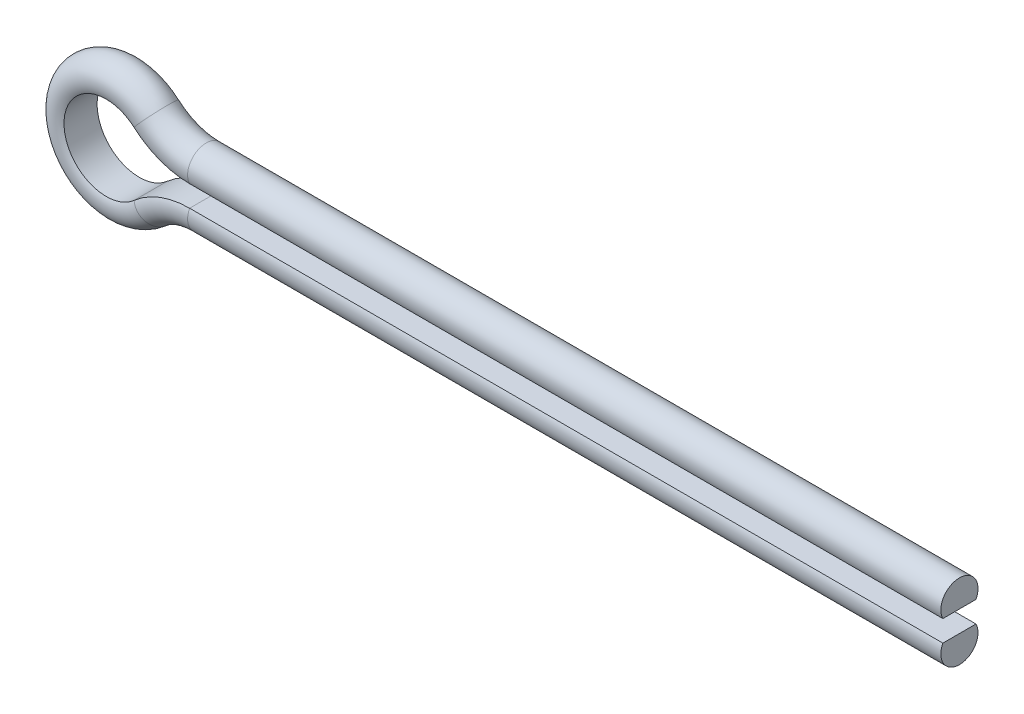
ISO-10303-21;
HEADER;
FILE_DESCRIPTION(('STEP AP214'),'2;1');
FILE_NAME('part.step','',(''),(''),'','','');
FILE_SCHEMA(('AUTOMOTIVE_DESIGN { 1 0 10303 214 1 1 1 1 }'));
ENDSEC;
DATA;
#1=APPLICATION_CONTEXT('core data for automotive mechanical design processes');
#2=APPLICATION_PROTOCOL_DEFINITION('international standard','automotive_design',2000,#1);
#3=PRODUCT_CONTEXT('',#1,'mechanical');
#4=PRODUCT('Part','Part','',(#3));
#5=PRODUCT_RELATED_PRODUCT_CATEGORY('part','',(#4));
#6=PRODUCT_DEFINITION_FORMATION('','',#4);
#7=PRODUCT_DEFINITION_CONTEXT('part definition',#1,'design');
#8=PRODUCT_DEFINITION('design','',#6,#7);
#9=PRODUCT_DEFINITION_SHAPE('','',#8);
#10=(LENGTH_UNIT() NAMED_UNIT(*) SI_UNIT(.MILLI.,.METRE.));
#11=(NAMED_UNIT(*) PLANE_ANGLE_UNIT() SI_UNIT($,.RADIAN.));
#12=(NAMED_UNIT(*) SI_UNIT($,.STERADIAN.) SOLID_ANGLE_UNIT());
#13=UNCERTAINTY_MEASURE_WITH_UNIT(LENGTH_MEASURE(1.E-05),#10,'distance_accuracy_value','');
#14=(GEOMETRIC_REPRESENTATION_CONTEXT(3) GLOBAL_UNCERTAINTY_ASSIGNED_CONTEXT((#13)) GLOBAL_UNIT_ASSIGNED_CONTEXT((#10,
#11,#12)) REPRESENTATION_CONTEXT('',''));
#15=CARTESIAN_POINT('',(0.,0.,0.));
#16=DIRECTION('',(0.,0.,1.));
#17=DIRECTION('',(1.,0.,0.));
#18=AXIS2_PLACEMENT_3D('',#15,#16,#17);
#19=CARTESIAN_POINT('',(956.940936911488,7.39227363049866,0.));
#20=DIRECTION('',(-1.,0.,0.));
#21=DIRECTION('',(0.,-1.,0.));
#22=AXIS2_PLACEMENT_3D('',#19,#20,#21);
#23=PLANE('',#22);
#24=CARTESIAN_POINT('',(956.940936911488,7.39227363049866,0.));
#25=DIRECTION('',(-1.,0.,0.));
#26=DIRECTION('',(0.,-1.,0.));
#27=AXIS2_PLACEMENT_3D('',#24,#25,#26);
#28=CIRCLE('',#27,22.0906627533993);
#29=CARTESIAN_POINT('',(956.940936911488,-2.60772636950265,19.6976491207554));
#30=VERTEX_POINT('',#29);
#31=CARTESIAN_POINT('',(956.940936911488,-2.60772636950265,-19.6976491207554));
#32=VERTEX_POINT('',#31);
#33=EDGE_CURVE('E79',#30,#32,#28,.T.);
#34=ORIENTED_EDGE('',*,*,#33,.F.);
#35=DIRECTION('',(0.,0.,1.));
#36=VECTOR('',#35,1.);
#37=CARTESIAN_POINT('',(956.940936911488,-2.60772636950265,19.6976491207554));
#38=LINE('',#37,#36);
#39=EDGE_CURVE('E81',#32,#30,#38,.T.);
#40=ORIENTED_EDGE('',*,*,#39,.F.);
#41=EDGE_LOOP('',(#34,#40));
#42=FACE_BOUND('',#41,.T.);
#43=ADVANCED_FACE('F33',(#42),#23,.F.);
#44=CARTESIAN_POINT('',(956.940936911488,-37.8597165883777,0.));
#45=DIRECTION('',(1.,0.,0.));
#46=DIRECTION('',(0.,1.,0.));
#47=AXIS2_PLACEMENT_3D('',#44,#45,#46);
#48=PLANE('',#47);
#49=CARTESIAN_POINT('',(956.940936911488,-37.8597165883777,0.));
#50=DIRECTION('',(1.,0.,0.));
#51=DIRECTION('',(0.,1.,0.));
#52=AXIS2_PLACEMENT_3D('',#49,#50,#51);
#53=CIRCLE('',#52,22.0906627533993);
#54=CARTESIAN_POINT('',(956.940936911488,-27.8597165883764,19.6976491207554));
#55=VERTEX_POINT('',#54);
#56=CARTESIAN_POINT('',(956.940936911488,-27.8597165883764,-19.6976491207554));
#57=VERTEX_POINT('',#56);
#58=EDGE_CURVE('E45',#55,#57,#53,.T.);
#59=ORIENTED_EDGE('',*,*,#58,.T.);
#60=DIRECTION('',(0.,0.,1.));
#61=VECTOR('',#60,1.);
#62=CARTESIAN_POINT('',(956.940936911488,-27.8597165883764,19.6976491207554));
#63=LINE('',#62,#61);
#64=EDGE_CURVE('E11',#57,#55,#63,.T.);
#65=ORIENTED_EDGE('',*,*,#64,.T.);
#66=EDGE_LOOP('',(#59,#65));
#67=FACE_BOUND('',#66,.T.);
#68=ADVANCED_FACE('F184',(#67),#48,.T.);
#69=CARTESIAN_POINT('',(956.940936911488,7.39227363049866,0.));
#70=DIRECTION('',(-1.,0.,0.));
#71=DIRECTION('',(0.,-1.,0.));
#72=AXIS2_PLACEMENT_3D('',#69,#70,#71);
#73=CYLINDRICAL_SURFACE('',#72,22.0906627533993);
#74=DIRECTION('',(-1.,0.,0.));
#75=VECTOR('',#74,1.);
#76=CARTESIAN_POINT('',(956.940936911488,-2.60772636950265,-19.6976491207554));
#77=LINE('',#76,#75);
#78=CARTESIAN_POINT('',(61.4743425774758,-2.60772636950276,-19.6976491207554));
#79=VERTEX_POINT('',#78);
#80=EDGE_CURVE('E92',#32,#79,#77,.T.);
#81=ORIENTED_EDGE('',*,*,#80,.T.);
#82=CARTESIAN_POINT('',(61.4743425774758,7.39227363049855,0.));
#83=DIRECTION('',(-1.,0.,0.));
#84=DIRECTION('',(0.,-1.,0.));
#85=AXIS2_PLACEMENT_3D('',#82,#83,#84);
#86=CIRCLE('',#85,22.0906627533993);
#87=CARTESIAN_POINT('',(61.4743425774758,-2.60772636950276,19.6976491207554));
#88=VERTEX_POINT('',#87);
#89=EDGE_CURVE('E97',#88,#79,#86,.T.);
#90=ORIENTED_EDGE('',*,*,#89,.F.);
#91=DIRECTION('',(-1.,0.,0.));
#92=VECTOR('',#91,1.);
#93=CARTESIAN_POINT('',(956.940936911488,-2.60772636950265,19.6976491207554));
#94=LINE('',#93,#92);
#95=EDGE_CURVE('E91',#30,#88,#94,.T.);
#96=ORIENTED_EDGE('',*,*,#95,.F.);
#97=ORIENTED_EDGE('',*,*,#33,.T.);
#98=EDGE_LOOP('',(#81,#90,#96,#97));
#99=FACE_BOUND('',#98,.T.);
#100=ADVANCED_FACE('F95',(#99),#73,.T.);
#101=CARTESIAN_POINT('',(956.940936911488,-2.60772636950265,19.6976491207554));
#102=DIRECTION('',(0.,-1.,0.));
#103=DIRECTION('',(1.,0.,0.));
#104=AXIS2_PLACEMENT_3D('',#101,#102,#103);
#105=PLANE('',#104);
#106=DIRECTION('',(0.,0.,1.));
#107=VECTOR('',#106,1.);
#108=CARTESIAN_POINT('',(61.4743425774758,-2.60772636950276,19.6976491207554));
#109=LINE('',#108,#107);
#110=EDGE_CURVE('E112',#79,#88,#109,.T.);
#111=ORIENTED_EDGE('',*,*,#110,.F.);
#112=ORIENTED_EDGE('',*,*,#80,.F.);
#113=ORIENTED_EDGE('',*,*,#39,.T.);
#114=ORIENTED_EDGE('',*,*,#95,.T.);
#115=EDGE_LOOP('',(#111,#112,#113,#114));
#116=FACE_BOUND('',#115,.T.);
#117=ADVANCED_FACE('F90',(#116),#105,.T.);
#118=CARTESIAN_POINT('',(61.4743425774757,97.2662785210603,0.));
#119=DIRECTION('',(0.,0.,-1.));
#120=DIRECTION('',(-1.,0.,0.));
#121=AXIS2_PLACEMENT_3D('',#118,#119,#120);
#122=TOROIDAL_SURFACE('',#121,89.8740048905617,22.0906627533993);
#123=CARTESIAN_POINT('',(61.4743425774757,97.2662785210603,-19.6976491207554));
#124=DIRECTION('',(0.,0.,-1.));
#125=DIRECTION('',(0.,-1.,0.));
#126=AXIS2_PLACEMENT_3D('',#123,#124,#125);
#127=CIRCLE('',#126,99.874004890563);
#128=CARTESIAN_POINT('',(-4.586102267644,22.3607748531382,-19.6976491207554));
#129=VERTEX_POINT('',#128);
#130=EDGE_CURVE('E105',#79,#129,#127,.T.);
#131=ORIENTED_EDGE('',*,*,#130,.T.);
#132=CARTESIAN_POINT('',(2.02827601001832,29.8607748531391,0.));
#133=DIRECTION('',(-0.749999999999999,0.661437827766149,0.));
#134=DIRECTION('',(-0.661437827766149,-0.749999999999999,0.));
#135=AXIS2_PLACEMENT_3D('',#132,#133,#134);
#136=CIRCLE('',#135,22.0906627533993);
#137=CARTESIAN_POINT('',(-4.586102267644,22.3607748531382,19.6976491207554));
#138=VERTEX_POINT('',#137);
#139=EDGE_CURVE('E102',#138,#129,#136,.T.);
#140=ORIENTED_EDGE('',*,*,#139,.F.);
#141=CARTESIAN_POINT('',(61.4743425774757,97.2662785210603,19.6976491207554));
#142=DIRECTION('',(0.,0.,-1.));
#143=DIRECTION('',(0.,-1.,0.));
#144=AXIS2_PLACEMENT_3D('',#141,#142,#143);
#145=CIRCLE('',#144,99.874004890563);
#146=EDGE_CURVE('E106',#88,#138,#145,.T.);
#147=ORIENTED_EDGE('',*,*,#146,.F.);
#148=ORIENTED_EDGE('',*,*,#89,.T.);
#149=EDGE_LOOP('',(#131,#140,#147,#148));
#150=FACE_BOUND('',#149,.T.);
#151=ADVANCED_FACE('F164',(#150),#122,.T.);
#152=CARTESIAN_POINT('',(61.4743425774757,97.2662785210603,0.));
#153=DIRECTION('',(0.,0.,-1.));
#154=DIRECTION('',(-1.,0.,0.));
#155=AXIS2_PLACEMENT_3D('',#152,#153,#154);
#156=CYLINDRICAL_SURFACE('',#155,99.874004890563);
#157=DIRECTION('',(0.,0.,1.));
#158=VECTOR('',#157,1.);
#159=CARTESIAN_POINT('',(-4.58610226764411,22.360774853138,19.6976491207554));
#160=LINE('',#159,#158);
#161=EDGE_CURVE('E109',#129,#138,#160,.T.);
#162=ORIENTED_EDGE('',*,*,#161,.F.);
#163=ORIENTED_EDGE('',*,*,#130,.F.);
#164=ORIENTED_EDGE('',*,*,#110,.T.);
#165=ORIENTED_EDGE('',*,*,#146,.T.);
#166=EDGE_LOOP('',(#162,#163,#164,#165));
#167=FACE_BOUND('',#166,.T.);
#168=ADVANCED_FACE('F165',(#167),#156,.T.);
#169=CARTESIAN_POINT('',(-37.7413315874465,-15.2337214789396,0.));
#170=DIRECTION('',(0.,0.,1.));
#171=DIRECTION('',(1.,0.,0.));
#172=AXIS2_PLACEMENT_3D('',#169,#170,#171);
#173=TOROIDAL_SURFACE('',#172,60.1259951094383,22.0906627533993);
#174=CARTESIAN_POINT('',(-37.7413315874465,-15.2337214789396,-19.6976491207554));
#175=DIRECTION('',(0.,0.,1.));
#176=DIRECTION('',(0.661437827766147,0.75,0.));
#177=AXIS2_PLACEMENT_3D('',#174,#175,#176);
#178=CIRCLE('',#177,50.1259951094368);
#179=CARTESIAN_POINT('',(-4.58610226764401,-52.8282178110171,-19.6976491207554));
#180=VERTEX_POINT('',#179);
#181=EDGE_CURVE('E116',#129,#180,#178,.T.);
#182=ORIENTED_EDGE('',*,*,#181,.T.);
#183=CARTESIAN_POINT('',(2.02827601001843,-60.3282178110182,0.));
#184=DIRECTION('',(0.75,0.661437827766148,0.));
#185=DIRECTION('',(-0.661437827766148,0.75,0.));
#186=AXIS2_PLACEMENT_3D('',#183,#184,#185);
#187=CIRCLE('',#186,22.0906627533993);
#188=CARTESIAN_POINT('',(-4.58610226764401,-52.8282178110171,19.6976491207554));
#189=VERTEX_POINT('',#188);
#190=EDGE_CURVE('E113',#189,#180,#187,.T.);
#191=ORIENTED_EDGE('',*,*,#190,.F.);
#192=CARTESIAN_POINT('',(-37.7413315874465,-15.2337214789396,19.6976491207554));
#193=DIRECTION('',(0.,0.,1.));
#194=DIRECTION('',(0.661437827766147,0.75,0.));
#195=AXIS2_PLACEMENT_3D('',#192,#193,#194);
#196=CIRCLE('',#195,50.1259951094368);
#197=EDGE_CURVE('E117',#138,#189,#196,.T.);
#198=ORIENTED_EDGE('',*,*,#197,.F.);
#199=ORIENTED_EDGE('',*,*,#139,.T.);
#200=EDGE_LOOP('',(#182,#191,#198,#199));
#201=FACE_BOUND('',#200,.T.);
#202=ADVANCED_FACE('F158',(#201),#173,.T.);
#203=CARTESIAN_POINT('',(-37.7413315874465,-15.2337214789396,0.));
#204=DIRECTION('',(0.,0.,1.));
#205=DIRECTION('',(1.,0.,0.));
#206=AXIS2_PLACEMENT_3D('',#203,#204,#205);
#207=CYLINDRICAL_SURFACE('',#206,50.1259951094368);
#208=DIRECTION('',(0.,0.,1.));
#209=VECTOR('',#208,1.);
#210=CARTESIAN_POINT('',(-4.586102267644,-52.8282178110171,19.6976491207554));
#211=LINE('',#210,#209);
#212=EDGE_CURVE('E120',#180,#189,#211,.T.);
#213=ORIENTED_EDGE('',*,*,#212,.F.);
#214=ORIENTED_EDGE('',*,*,#181,.F.);
#215=ORIENTED_EDGE('',*,*,#161,.T.);
#216=ORIENTED_EDGE('',*,*,#197,.T.);
#217=EDGE_LOOP('',(#213,#214,#215,#216));
#218=FACE_BOUND('',#217,.T.);
#219=ADVANCED_FACE('F159',(#218),#207,.F.);
#220=CARTESIAN_POINT('',(61.4743425774758,-127.733721478939,0.));
#221=DIRECTION('',(0.,0.,-1.));
#222=DIRECTION('',(-1.,0.,0.));
#223=AXIS2_PLACEMENT_3D('',#220,#221,#222);
#224=TOROIDAL_SURFACE('',#223,89.8740048905617,22.0906627533993);
#225=CARTESIAN_POINT('',(61.4743425774758,-127.733721478939,-19.6976491207554));
#226=DIRECTION('',(0.,0.,-1.));
#227=DIRECTION('',(-0.661437827766148,0.749999999999999,0.));
#228=AXIS2_PLACEMENT_3D('',#225,#226,#227);
#229=CIRCLE('',#228,99.8740048905631);
#230=CARTESIAN_POINT('',(61.4743425774758,-27.8597165883764,-19.6976491207554));
#231=VERTEX_POINT('',#230);
#232=EDGE_CURVE('E126',#180,#231,#229,.T.);
#233=ORIENTED_EDGE('',*,*,#232,.T.);
#234=CARTESIAN_POINT('',(61.4743425774758,-37.8597165883778,0.));
#235=DIRECTION('',(1.,0.,0.));
#236=DIRECTION('',(0.,1.,0.));
#237=AXIS2_PLACEMENT_3D('',#234,#235,#236);
#238=CIRCLE('',#237,22.0906627533993);
#239=CARTESIAN_POINT('',(61.4743425774758,-27.8597165883764,19.6976491207554));
#240=VERTEX_POINT('',#239);
#241=EDGE_CURVE('E123',#240,#231,#238,.T.);
#242=ORIENTED_EDGE('',*,*,#241,.F.);
#243=CARTESIAN_POINT('',(61.4743425774758,-127.733721478939,19.6976491207554));
#244=DIRECTION('',(0.,0.,-1.));
#245=DIRECTION('',(-0.661437827766148,0.749999999999999,0.));
#246=AXIS2_PLACEMENT_3D('',#243,#244,#245);
#247=CIRCLE('',#246,99.8740048905631);
#248=EDGE_CURVE('E127',#189,#240,#247,.T.);
#249=ORIENTED_EDGE('',*,*,#248,.F.);
#250=ORIENTED_EDGE('',*,*,#190,.T.);
#251=EDGE_LOOP('',(#233,#242,#249,#250));
#252=FACE_BOUND('',#251,.T.);
#253=ADVANCED_FACE('F151',(#252),#224,.T.);
#254=CARTESIAN_POINT('',(61.4743425774758,-127.733721478939,0.));
#255=DIRECTION('',(0.,0.,-1.));
#256=DIRECTION('',(-1.,0.,0.));
#257=AXIS2_PLACEMENT_3D('',#254,#255,#256);
#258=CYLINDRICAL_SURFACE('',#257,99.8740048905631);
#259=DIRECTION('',(0.,0.,1.));
#260=VECTOR('',#259,1.);
#261=CARTESIAN_POINT('',(61.4743425774758,-27.8597165883764,19.6976491207554));
#262=LINE('',#261,#260);
#263=EDGE_CURVE('E130',#231,#240,#262,.T.);
#264=ORIENTED_EDGE('',*,*,#263,.F.);
#265=ORIENTED_EDGE('',*,*,#232,.F.);
#266=ORIENTED_EDGE('',*,*,#212,.T.);
#267=ORIENTED_EDGE('',*,*,#248,.T.);
#268=EDGE_LOOP('',(#264,#265,#266,#267));
#269=FACE_BOUND('',#268,.T.);
#270=ADVANCED_FACE('F153',(#269),#258,.T.);
#271=CARTESIAN_POINT('',(61.4743425774758,-37.8597165883778,0.));
#272=DIRECTION('',(1.,0.,0.));
#273=DIRECTION('',(0.,1.,0.));
#274=AXIS2_PLACEMENT_3D('',#271,#272,#273);
#275=CYLINDRICAL_SURFACE('',#274,22.0906627533993);
#276=DIRECTION('',(1.,0.,0.));
#277=VECTOR('',#276,1.);
#278=CARTESIAN_POINT('',(61.4743425774758,-27.8597165883765,-19.6976491207554));
#279=LINE('',#278,#277);
#280=EDGE_CURVE('E40',#231,#57,#279,.T.);
#281=ORIENTED_EDGE('',*,*,#280,.T.);
#282=ORIENTED_EDGE('',*,*,#58,.F.);
#283=DIRECTION('',(1.,0.,0.));
#284=VECTOR('',#283,1.);
#285=CARTESIAN_POINT('',(61.4743425774758,-27.8597165883765,19.6976491207554));
#286=LINE('',#285,#284);
#287=EDGE_CURVE('E134',#240,#55,#286,.T.);
#288=ORIENTED_EDGE('',*,*,#287,.F.);
#289=ORIENTED_EDGE('',*,*,#241,.T.);
#290=EDGE_LOOP('',(#281,#282,#288,#289));
#291=FACE_BOUND('',#290,.T.);
#292=ADVANCED_FACE('F177',(#291),#275,.T.);
#293=CARTESIAN_POINT('',(61.4743425774758,-27.8597165883765,19.6976491207554));
#294=DIRECTION('',(0.,1.,0.));
#295=DIRECTION('',(-1.,0.,0.));
#296=AXIS2_PLACEMENT_3D('',#293,#294,#295);
#297=PLANE('',#296);
#298=ORIENTED_EDGE('',*,*,#64,.F.);
#299=ORIENTED_EDGE('',*,*,#280,.F.);
#300=ORIENTED_EDGE('',*,*,#263,.T.);
#301=ORIENTED_EDGE('',*,*,#287,.T.);
#302=EDGE_LOOP('',(#298,#299,#300,#301));
#303=FACE_BOUND('',#302,.T.);
#304=ADVANCED_FACE('F148',(#303),#297,.T.);
#305=CLOSED_SHELL('',(#43,#68,#100,#117,#151,#168,#202,#219,#253,#270,#292,#304));
#306=MANIFOLD_SOLID_BREP('B2',#305);
#307=ADVANCED_BREP_SHAPE_REPRESENTATION('',(#18,#306),#14);
#308=SHAPE_DEFINITION_REPRESENTATION(#9,#307);
ENDSEC;
END-ISO-10303-21;
